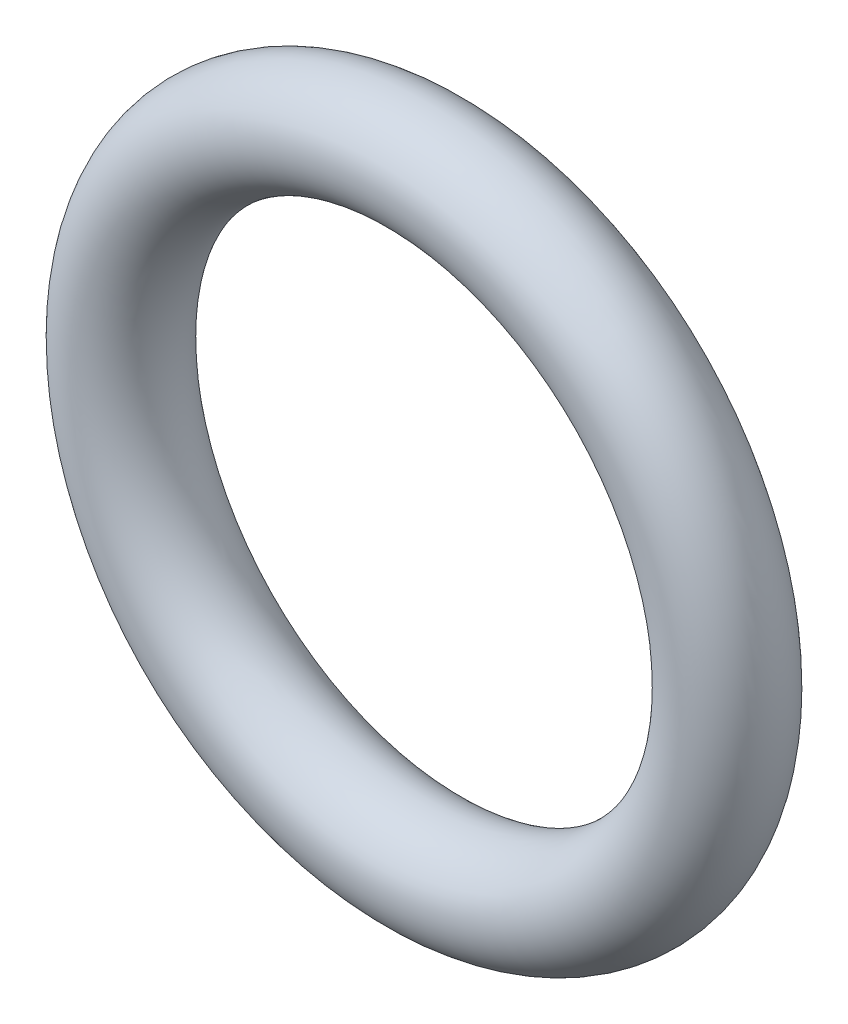
ISO-10303-21;
HEADER;
FILE_DESCRIPTION(('STEP AP214'),'2;1');
FILE_NAME('part.step','',(''),(''),'','','');
FILE_SCHEMA(('AUTOMOTIVE_DESIGN { 1 0 10303 214 1 1 1 1 }'));
ENDSEC;
DATA;
#1=APPLICATION_CONTEXT('core data for automotive mechanical design processes');
#2=APPLICATION_PROTOCOL_DEFINITION('international standard','automotive_design',2000,#1);
#3=PRODUCT_CONTEXT('',#1,'mechanical');
#4=PRODUCT('Part','Part','',(#3));
#5=PRODUCT_RELATED_PRODUCT_CATEGORY('part','',(#4));
#6=PRODUCT_DEFINITION_FORMATION('','',#4);
#7=PRODUCT_DEFINITION_CONTEXT('part definition',#1,'design');
#8=PRODUCT_DEFINITION('design','',#6,#7);
#9=PRODUCT_DEFINITION_SHAPE('','',#8);
#10=(LENGTH_UNIT() NAMED_UNIT(*) SI_UNIT(.MILLI.,.METRE.));
#11=(NAMED_UNIT(*) PLANE_ANGLE_UNIT() SI_UNIT($,.RADIAN.));
#12=(NAMED_UNIT(*) SI_UNIT($,.STERADIAN.) SOLID_ANGLE_UNIT());
#13=UNCERTAINTY_MEASURE_WITH_UNIT(LENGTH_MEASURE(1.E-05),#10,'distance_accuracy_value','');
#14=(GEOMETRIC_REPRESENTATION_CONTEXT(3) GLOBAL_UNCERTAINTY_ASSIGNED_CONTEXT((#13)) GLOBAL_UNIT_ASSIGNED_CONTEXT((#10,
#11,#12)) REPRESENTATION_CONTEXT('',''));
#15=CARTESIAN_POINT('',(0.,0.,0.));
#16=DIRECTION('',(0.,0.,1.));
#17=DIRECTION('',(1.,0.,0.));
#18=AXIS2_PLACEMENT_3D('',#15,#16,#17);
#19=CARTESIAN_POINT('',(0.,0.,0.));
#20=DIRECTION('',(0.,0.,1.));
#21=DIRECTION('',(1.,0.,0.));
#22=AXIS2_PLACEMENT_3D('',#19,#20,#21);
#23=TOROIDAL_SURFACE('',#22,7.493,1.3081);
#24=CARTESIAN_POINT('',(8.8011,0.,0.));
#25=VERTEX_POINT('',#24);
#26=VERTEX_LOOP('',#25);
#27=FACE_BOUND('',#26,.T.);
#28=ADVANCED_FACE('F28',(#27),#23,.T.);
#29=CLOSED_SHELL('',(#28));
#30=MANIFOLD_SOLID_BREP('B2',#29);
#31=ADVANCED_BREP_SHAPE_REPRESENTATION('',(#18,#30),#14);
#32=SHAPE_DEFINITION_REPRESENTATION(#9,#31);
ENDSEC;
END-ISO-10303-21;
